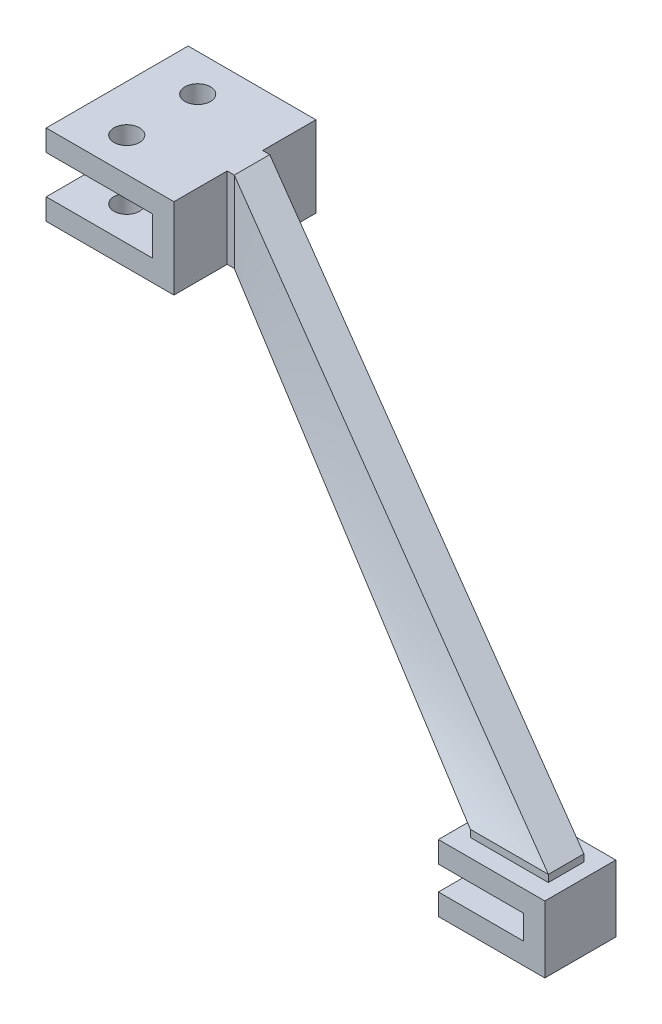
ISO-10303-21;
HEADER;
FILE_DESCRIPTION(('STEP AP214'),'2;1');
FILE_NAME('part.step','',(''),(''),'','','');
FILE_SCHEMA(('AUTOMOTIVE_DESIGN { 1 0 10303 214 1 1 1 1 }'));
ENDSEC;
DATA;
#1=APPLICATION_CONTEXT('core data for automotive mechanical design processes');
#2=APPLICATION_PROTOCOL_DEFINITION('international standard','automotive_design',2000,#1);
#3=PRODUCT_CONTEXT('',#1,'mechanical');
#4=PRODUCT('Part','Part','',(#3));
#5=PRODUCT_RELATED_PRODUCT_CATEGORY('part','',(#4));
#6=PRODUCT_DEFINITION_FORMATION('','',#4);
#7=PRODUCT_DEFINITION_CONTEXT('part definition',#1,'design');
#8=PRODUCT_DEFINITION('design','',#6,#7);
#9=PRODUCT_DEFINITION_SHAPE('','',#8);
#10=(LENGTH_UNIT() NAMED_UNIT(*) SI_UNIT(.MILLI.,.METRE.));
#11=(NAMED_UNIT(*) PLANE_ANGLE_UNIT() SI_UNIT($,.RADIAN.));
#12=(NAMED_UNIT(*) SI_UNIT($,.STERADIAN.) SOLID_ANGLE_UNIT());
#13=UNCERTAINTY_MEASURE_WITH_UNIT(LENGTH_MEASURE(1.E-05),#10,'distance_accuracy_value','');
#14=(GEOMETRIC_REPRESENTATION_CONTEXT(3) GLOBAL_UNCERTAINTY_ASSIGNED_CONTEXT((#13)) GLOBAL_UNIT_ASSIGNED_CONTEXT((#10,
#11,#12)) REPRESENTATION_CONTEXT('',''));
#15=CARTESIAN_POINT('',(0.,0.,0.));
#16=DIRECTION('',(0.,0.,1.));
#17=DIRECTION('',(1.,0.,0.));
#18=AXIS2_PLACEMENT_3D('',#15,#16,#17);
#19=CARTESIAN_POINT('',(221.450000104179,82.6999999999999,83.8053363288418));
#20=DIRECTION('',(1.,0.,-3.19998000319899E-09));
#21=DIRECTION('',(3.19998000319899E-09,0.,1.));
#22=AXIS2_PLACEMENT_3D('',#19,#20,#21);
#23=PLANE('',#22);
#24=DIRECTION('',(0.,-1.,0.));
#25=VECTOR('',#24,1.);
#26=CARTESIAN_POINT('',(221.44999999536,82.6999999999999,49.7989992433643));
#27=LINE('',#26,#25);
#28=CARTESIAN_POINT('',(221.44999999536,82.6999999999999,49.7989992433643));
#29=VERTEX_POINT('',#28);
#30=CARTESIAN_POINT('',(221.44999999536,71.2999999999999,49.7989992433643));
#31=VERTEX_POINT('',#30);
#32=EDGE_CURVE('E329',#29,#31,#27,.T.);
#33=ORIENTED_EDGE('',*,*,#32,.T.);
#34=DIRECTION('',(-3.19998000319899E-09,0.,-1.));
#35=VECTOR('',#34,1.);
#36=CARTESIAN_POINT('',(221.450000104179,71.2999999999999,83.8053363288418));
#37=LINE('',#36,#35);
#38=CARTESIAN_POINT('',(221.44999997136,71.2999999999999,42.2989992433645));
#39=VERTEX_POINT('',#38);
#40=EDGE_CURVE('E459',#31,#39,#37,.T.);
#41=ORIENTED_EDGE('',*,*,#40,.T.);
#42=DIRECTION('',(0.,1.,0.));
#43=VECTOR('',#42,1.);
#44=CARTESIAN_POINT('',(221.44999997136,82.6999999999999,42.2989992433645));
#45=LINE('',#44,#43);
#46=CARTESIAN_POINT('',(221.44999997136,82.6999999999999,42.2989992433645));
#47=VERTEX_POINT('',#46);
#48=EDGE_CURVE('E413',#39,#47,#45,.T.);
#49=ORIENTED_EDGE('',*,*,#48,.T.);
#50=DIRECTION('',(-3.19998000319899E-09,0.,-1.));
#51=VECTOR('',#50,1.);
#52=CARTESIAN_POINT('',(221.450000104179,82.6999999999999,83.8053363288418));
#53=LINE('',#52,#51);
#54=EDGE_CURVE('E456',#29,#47,#53,.T.);
#55=ORIENTED_EDGE('',*,*,#54,.F.);
#56=EDGE_LOOP('',(#33,#41,#49,#55));
#57=FACE_BOUND('',#56,.T.);
#58=ADVANCED_FACE('F100',(#57),#23,.T.);
#59=CARTESIAN_POINT('',(203.450000104179,71.2999999999999,83.8053363864415));
#60=DIRECTION('',(-1.,0.,3.19998000319899E-09));
#61=DIRECTION('',(-3.19998000319899E-09,0.,-1.));
#62=AXIS2_PLACEMENT_3D('',#59,#60,#61);
#63=PLANE('',#62);
#64=DIRECTION('',(0.,1.,0.));
#65=VECTOR('',#64,1.);
#66=CARTESIAN_POINT('',(203.450000035359,71.2999999999999,62.2989993009638));
#67=LINE('',#66,#65);
#68=CARTESIAN_POINT('',(203.44999997136,71.2999999999999,62.2989993009638));
#69=VERTEX_POINT('',#68);
#70=CARTESIAN_POINT('',(203.44999997136,74.2999999999999,62.2989993009638));
#71=VERTEX_POINT('',#70);
#72=EDGE_CURVE('E109',#69,#71,#67,.T.);
#73=ORIENTED_EDGE('',*,*,#72,.T.);
#74=DIRECTION('',(-3.19998000319899E-09,0.,-1.));
#75=VECTOR('',#74,1.);
#76=CARTESIAN_POINT('',(203.450000104179,74.2999999999999,83.8053363864415));
#77=LINE('',#76,#75);
#78=CARTESIAN_POINT('',(203.44999997136,74.2999999999999,42.2989993009641));
#79=VERTEX_POINT('',#78);
#80=EDGE_CURVE('E384',#71,#79,#77,.T.);
#81=ORIENTED_EDGE('',*,*,#80,.T.);
#82=DIRECTION('',(0.,-1.,0.));
#83=VECTOR('',#82,1.);
#84=CARTESIAN_POINT('',(203.44999997136,71.2999999999999,42.2989993009641));
#85=LINE('',#84,#83);
#86=CARTESIAN_POINT('',(203.44999997136,71.2999999999999,42.2989993009641));
#87=VERTEX_POINT('',#86);
#88=EDGE_CURVE('E378',#79,#87,#85,.T.);
#89=ORIENTED_EDGE('',*,*,#88,.T.);
#90=DIRECTION('',(-3.19998000319899E-09,0.,-1.));
#91=VECTOR('',#90,1.);
#92=CARTESIAN_POINT('',(203.450000104179,71.2999999999999,83.8053363864415));
#93=LINE('',#92,#91);
#94=EDGE_CURVE('E432',#69,#87,#93,.T.);
#95=ORIENTED_EDGE('',*,*,#94,.F.);
#96=EDGE_LOOP('',(#73,#81,#89,#95));
#97=FACE_BOUND('',#96,.T.);
#98=ADVANCED_FACE('F102',(#97),#63,.T.);
#99=CARTESIAN_POINT('',(203.450000104179,74.2999999999999,83.8053363864415));
#100=DIRECTION('',(0.,1.,0.));
#101=DIRECTION('',(0.,0.,-1.));
#102=AXIS2_PLACEMENT_3D('',#99,#100,#101);
#103=PLANE('',#102);
#104=CARTESIAN_POINT('',(209.999999988,74.2999999999999,47.4989992800042));
#105=DIRECTION('',(0.,-1.,0.));
#106=DIRECTION('',(0.,0.,-1.));
#107=AXIS2_PLACEMENT_3D('',#104,#105,#106);
#108=CIRCLE('',#107,1.8);
#109=CARTESIAN_POINT('',(209.999999988,74.2999999999999,45.6989992800042));
#110=VERTEX_POINT('',#109);
#111=EDGE_CURVE('E354',#110,#110,#108,.T.);
#112=ORIENTED_EDGE('',*,*,#111,.T.);
#113=EDGE_LOOP('',(#112));
#114=FACE_BOUND('',#113,.T.);
#115=CARTESIAN_POINT('',(210.000000019999,74.2999999999999,57.4989992800042));
#116=DIRECTION('',(0.,-1.,0.));
#117=DIRECTION('',(0.,0.,-1.));
#118=AXIS2_PLACEMENT_3D('',#115,#116,#117);
#119=CIRCLE('',#118,1.8);
#120=CARTESIAN_POINT('',(210.000000019999,74.2999999999999,55.6989992800042));
#121=VERTEX_POINT('',#120);
#122=EDGE_CURVE('E370',#121,#121,#119,.T.);
#123=ORIENTED_EDGE('',*,*,#122,.T.);
#124=EDGE_LOOP('',(#123));
#125=FACE_BOUND('',#124,.T.);
#126=DIRECTION('',(1.,0.,-3.19998172404468E-09));
#127=VECTOR('',#126,1.);
#128=CARTESIAN_POINT('',(203.450000035359,74.2999999999999,62.2989993009638));
#129=LINE('',#128,#127);
#130=CARTESIAN_POINT('',(218.450000035359,74.2999999999999,62.2989992529641));
#131=VERTEX_POINT('',#130);
#132=EDGE_CURVE('E400',#71,#131,#129,.T.);
#133=ORIENTED_EDGE('',*,*,#132,.T.);
#134=DIRECTION('',(-3.19998000319899E-09,0.,-1.));
#135=VECTOR('',#134,1.);
#136=CARTESIAN_POINT('',(218.450000104179,74.2999999999999,83.8053363384417));
#137=LINE('',#136,#135);
#138=CARTESIAN_POINT('',(218.44999997136,74.2999999999999,42.2989992529644));
#139=VERTEX_POINT('',#138);
#140=EDGE_CURVE('E436',#131,#139,#137,.T.);
#141=ORIENTED_EDGE('',*,*,#140,.T.);
#142=DIRECTION('',(-1.,0.,3.19998009571757E-09));
#143=VECTOR('',#142,1.);
#144=CARTESIAN_POINT('',(203.44999997136,74.2999999999999,42.2989993009641));
#145=LINE('',#144,#143);
#146=EDGE_CURVE('E429',#139,#79,#145,.T.);
#147=ORIENTED_EDGE('',*,*,#146,.T.);
#148=ORIENTED_EDGE('',*,*,#80,.F.);
#149=EDGE_LOOP('',(#133,#141,#147,#148));
#150=FACE_BOUND('',#149,.T.);
#151=ADVANCED_FACE('F648',(#114,#125,#150),#103,.T.);
#152=CARTESIAN_POINT('',(218.450000104179,74.2999999999999,83.8053363384417));
#153=DIRECTION('',(-1.,0.,3.19998000319899E-09));
#154=DIRECTION('',(-3.19998000319899E-09,0.,-1.));
#155=AXIS2_PLACEMENT_3D('',#152,#153,#154);
#156=PLANE('',#155);
#157=DIRECTION('',(0.,1.,0.));
#158=VECTOR('',#157,1.);
#159=CARTESIAN_POINT('',(218.450000035359,74.2999999999999,62.2989992529641));
#160=LINE('',#159,#158);
#161=CARTESIAN_POINT('',(218.450000104179,79.6999999999999,62.2989992529641));
#162=VERTEX_POINT('',#161);
#163=EDGE_CURVE('E396',#131,#162,#160,.T.);
#164=ORIENTED_EDGE('',*,*,#163,.T.);
#165=DIRECTION('',(-3.19998000319899E-09,0.,-1.));
#166=VECTOR('',#165,1.);
#167=CARTESIAN_POINT('',(218.450000104179,79.6999999999999,83.8053363384417));
#168=LINE('',#167,#166);
#169=CARTESIAN_POINT('',(218.44999997136,79.6999999999999,42.2989992529644));
#170=VERTEX_POINT('',#169);
#171=EDGE_CURVE('E440',#162,#170,#168,.T.);
#172=ORIENTED_EDGE('',*,*,#171,.T.);
#173=DIRECTION('',(0.,-1.,0.));
#174=VECTOR('',#173,1.);
#175=CARTESIAN_POINT('',(218.44999997136,74.2999999999999,42.2989992529644));
#176=LINE('',#175,#174);
#177=EDGE_CURVE('E426',#170,#139,#176,.T.);
#178=ORIENTED_EDGE('',*,*,#177,.T.);
#179=ORIENTED_EDGE('',*,*,#140,.F.);
#180=EDGE_LOOP('',(#164,#172,#178,#179));
#181=FACE_BOUND('',#180,.T.);
#182=ADVANCED_FACE('F674',(#181),#156,.T.);
#183=CARTESIAN_POINT('',(218.450000104179,79.6999999999999,83.8053363384417));
#184=DIRECTION('',(0.,-1.,0.));
#185=DIRECTION('',(0.,0.,1.));
#186=AXIS2_PLACEMENT_3D('',#183,#184,#185);
#187=PLANE('',#186);
#188=CARTESIAN_POINT('',(209.999999988,79.6999999999999,47.4989992800042));
#189=DIRECTION('',(0.,1.,0.));
#190=DIRECTION('',(0.,0.,1.));
#191=AXIS2_PLACEMENT_3D('',#188,#189,#190);
#192=CIRCLE('',#191,1.8);
#193=CARTESIAN_POINT('',(209.999999988,79.6999999999999,49.2989992800042));
#194=VERTEX_POINT('',#193);
#195=EDGE_CURVE('E358',#194,#194,#192,.T.);
#196=ORIENTED_EDGE('',*,*,#195,.T.);
#197=EDGE_LOOP('',(#196));
#198=FACE_BOUND('',#197,.T.);
#199=CARTESIAN_POINT('',(210.000000019999,79.6999999999999,57.4989992800042));
#200=DIRECTION('',(0.,1.,0.));
#201=DIRECTION('',(0.,0.,1.));
#202=AXIS2_PLACEMENT_3D('',#199,#200,#201);
#203=CIRCLE('',#202,1.8);
#204=CARTESIAN_POINT('',(210.000000019999,79.6999999999999,59.2989992800042));
#205=VERTEX_POINT('',#204);
#206=EDGE_CURVE('E374',#205,#205,#203,.T.);
#207=ORIENTED_EDGE('',*,*,#206,.T.);
#208=EDGE_LOOP('',(#207));
#209=FACE_BOUND('',#208,.T.);
#210=DIRECTION('',(-1.,0.,3.19998172404468E-09));
#211=VECTOR('',#210,1.);
#212=CARTESIAN_POINT('',(218.450000035359,79.6999999999999,62.2989992529641));
#213=LINE('',#212,#211);
#214=CARTESIAN_POINT('',(203.450000035359,79.6999999999999,62.2989993009638));
#215=VERTEX_POINT('',#214);
#216=EDGE_CURVE('E392',#162,#215,#213,.T.);
#217=ORIENTED_EDGE('',*,*,#216,.T.);
#218=DIRECTION('',(-3.19998000319899E-09,0.,-1.));
#219=VECTOR('',#218,1.);
#220=CARTESIAN_POINT('',(203.450000104179,79.6999999999999,83.8053363864415));
#221=LINE('',#220,#219);
#222=CARTESIAN_POINT('',(203.44999997136,79.6999999999999,42.2989993009641));
#223=VERTEX_POINT('',#222);
#224=EDGE_CURVE('E444',#215,#223,#221,.T.);
#225=ORIENTED_EDGE('',*,*,#224,.T.);
#226=DIRECTION('',(1.,0.,-3.19998009571757E-09));
#227=VECTOR('',#226,1.);
#228=CARTESIAN_POINT('',(218.44999997136,79.6999999999999,42.2989992529644));
#229=LINE('',#228,#227);
#230=EDGE_CURVE('E423',#223,#170,#229,.T.);
#231=ORIENTED_EDGE('',*,*,#230,.T.);
#232=ORIENTED_EDGE('',*,*,#171,.F.);
#233=EDGE_LOOP('',(#217,#225,#231,#232));
#234=FACE_BOUND('',#233,.T.);
#235=ADVANCED_FACE('F677',(#198,#209,#234),#187,.T.);
#236=CARTESIAN_POINT('',(203.450000104179,79.6999999999999,83.8053363864415));
#237=DIRECTION('',(-1.,0.,3.19998000319899E-09));
#238=DIRECTION('',(-3.19998000319899E-09,0.,-1.));
#239=AXIS2_PLACEMENT_3D('',#236,#237,#238);
#240=PLANE('',#239);
#241=DIRECTION('',(0.,1.,0.));
#242=VECTOR('',#241,1.);
#243=CARTESIAN_POINT('',(203.450000035359,79.6999999999999,62.2989993009638));
#244=LINE('',#243,#242);
#245=CARTESIAN_POINT('',(203.44999997136,82.6999999999999,62.2989993009638));
#246=VERTEX_POINT('',#245);
#247=EDGE_CURVE('E388',#215,#246,#244,.T.);
#248=ORIENTED_EDGE('',*,*,#247,.T.);
#249=DIRECTION('',(-3.19998000319899E-09,0.,-1.));
#250=VECTOR('',#249,1.);
#251=CARTESIAN_POINT('',(203.450000104179,82.6999999999999,83.8053363864415));
#252=LINE('',#251,#250);
#253=CARTESIAN_POINT('',(203.44999997136,82.6999999999999,42.2989993009641));
#254=VERTEX_POINT('',#253);
#255=EDGE_CURVE('E448',#246,#254,#252,.T.);
#256=ORIENTED_EDGE('',*,*,#255,.T.);
#257=DIRECTION('',(0.,-1.,0.));
#258=VECTOR('',#257,1.);
#259=CARTESIAN_POINT('',(203.44999997136,79.6999999999999,42.2989993009641));
#260=LINE('',#259,#258);
#261=EDGE_CURVE('E420',#254,#223,#260,.T.);
#262=ORIENTED_EDGE('',*,*,#261,.T.);
#263=ORIENTED_EDGE('',*,*,#224,.F.);
#264=EDGE_LOOP('',(#248,#256,#262,#263));
#265=FACE_BOUND('',#264,.T.);
#266=ADVANCED_FACE('F658',(#265),#240,.T.);
#267=CARTESIAN_POINT('',(203.450000104179,82.6999999999999,83.8053363864415));
#268=DIRECTION('',(0.,1.,0.));
#269=DIRECTION('',(0.,0.,-1.));
#270=AXIS2_PLACEMENT_3D('',#267,#268,#269);
#271=PLANE('',#270);
#272=CARTESIAN_POINT('',(209.999999988,82.6999999999999,47.4989992800042));
#273=DIRECTION('',(0.,-1.,0.));
#274=DIRECTION('',(0.,0.,-1.));
#275=AXIS2_PLACEMENT_3D('',#272,#273,#274);
#276=CIRCLE('',#275,1.8);
#277=CARTESIAN_POINT('',(209.999999988,82.6999999999999,45.6989992800042));
#278=VERTEX_POINT('',#277);
#279=EDGE_CURVE('E346',#278,#278,#276,.T.);
#280=ORIENTED_EDGE('',*,*,#279,.T.);
#281=EDGE_LOOP('',(#280));
#282=FACE_BOUND('',#281,.T.);
#283=CARTESIAN_POINT('',(210.000000019999,82.6999999999999,57.4989992800042));
#284=DIRECTION('',(0.,-1.,0.));
#285=DIRECTION('',(0.,0.,-1.));
#286=AXIS2_PLACEMENT_3D('',#283,#284,#285);
#287=CIRCLE('',#286,1.8);
#288=CARTESIAN_POINT('',(210.000000019999,82.6999999999999,55.6989992800042));
#289=VERTEX_POINT('',#288);
#290=EDGE_CURVE('E362',#289,#289,#287,.T.);
#291=ORIENTED_EDGE('',*,*,#290,.T.);
#292=EDGE_LOOP('',(#291));
#293=FACE_BOUND('',#292,.T.);
#294=DIRECTION('',(1.,0.,-3.19998172404468E-09));
#295=VECTOR('',#294,1.);
#296=CARTESIAN_POINT('',(203.450000035359,82.6999999999999,62.2989993009638));
#297=LINE('',#296,#295);
#298=CARTESIAN_POINT('',(221.450000035359,82.6999999999999,62.2989992433642));
#299=VERTEX_POINT('',#298);
#300=EDGE_CURVE('E383',#246,#299,#297,.T.);
#301=ORIENTED_EDGE('',*,*,#300,.T.);
#302=CARTESIAN_POINT('',(221.450000011359,82.6999999999999,54.7989992433643));
#303=VERTEX_POINT('',#302);
#304=EDGE_CURVE('E452',#299,#303,#53,.T.);
#305=ORIENTED_EDGE('',*,*,#304,.T.);
#306=DIRECTION('',(-1.,0.,3.19998000319899E-09));
#307=VECTOR('',#306,1.);
#308=CARTESIAN_POINT('',(222.450000011359,82.6999999999999,54.7989992401643));
#309=LINE('',#308,#307);
#310=CARTESIAN_POINT('',(222.450000011359,82.6999999999999,54.7989992401643));
#311=VERTEX_POINT('',#310);
#312=EDGE_CURVE('E338',#311,#303,#309,.T.);
#313=ORIENTED_EDGE('',*,*,#312,.F.);
#314=DIRECTION('',(-3.19997917053172E-09,0.,-1.));
#315=VECTOR('',#314,1.);
#316=CARTESIAN_POINT('',(222.44999999536,82.6999999999999,49.7989992401643));
#317=LINE('',#316,#315);
#318=CARTESIAN_POINT('',(222.44999999536,82.6999999999999,49.7989992401643));
#319=VERTEX_POINT('',#318);
#320=EDGE_CURVE('E324',#311,#319,#317,.T.);
#321=ORIENTED_EDGE('',*,*,#320,.T.);
#322=DIRECTION('',(-1.,0.,3.19998000319899E-09));
#323=VECTOR('',#322,1.);
#324=CARTESIAN_POINT('',(222.44999999536,82.6999999999999,49.7989992401643));
#325=LINE('',#324,#323);
#326=EDGE_CURVE('E328',#319,#29,#325,.T.);
#327=ORIENTED_EDGE('',*,*,#326,.T.);
#328=ORIENTED_EDGE('',*,*,#54,.T.);
#329=DIRECTION('',(-1.,0.,3.19998001861875E-09));
#330=VECTOR('',#329,1.);
#331=CARTESIAN_POINT('',(203.44999997136,82.6999999999999,42.2989993009641));
#332=LINE('',#331,#330);
#333=EDGE_CURVE('E417',#47,#254,#332,.T.);
#334=ORIENTED_EDGE('',*,*,#333,.T.);
#335=ORIENTED_EDGE('',*,*,#255,.F.);
#336=EDGE_LOOP('',(#301,#305,#313,#321,#327,#328,#334,#335));
#337=FACE_BOUND('',#336,.T.);
#338=ADVANCED_FACE('F477',(#282,#293,#337),#271,.T.);
#339=DIRECTION('',(0.,1.,0.));
#340=VECTOR('',#339,1.);
#341=CARTESIAN_POINT('',(221.450000011359,82.6999999999999,54.7989992433643));
#342=LINE('',#341,#340);
#343=CARTESIAN_POINT('',(221.450000011359,71.2999999999999,54.7989992433643));
#344=VERTEX_POINT('',#343);
#345=EDGE_CURVE('E319',#344,#303,#342,.T.);
#346=ORIENTED_EDGE('',*,*,#345,.T.);
#347=ORIENTED_EDGE('',*,*,#304,.F.);
#348=DIRECTION('',(0.,-1.,0.));
#349=VECTOR('',#348,1.);
#350=CARTESIAN_POINT('',(221.450000035359,82.6999999999999,62.2989992433642));
#351=LINE('',#350,#349);
#352=CARTESIAN_POINT('',(221.450000035359,71.2999999999999,62.298999272164));
#353=VERTEX_POINT('',#352);
#354=EDGE_CURVE('E379',#299,#353,#351,.T.);
#355=ORIENTED_EDGE('',*,*,#354,.T.);
#356=EDGE_CURVE('E457',#353,#344,#37,.T.);
#357=ORIENTED_EDGE('',*,*,#356,.T.);
#358=EDGE_LOOP('',(#346,#347,#355,#357));
#359=FACE_BOUND('',#358,.T.);
#360=ADVANCED_FACE('F644',(#359),#23,.T.);
#361=CARTESIAN_POINT('',(221.450000104179,71.2999999999999,83.8053363288418));
#362=DIRECTION('',(0.,-1.,0.));
#363=DIRECTION('',(0.,0.,1.));
#364=AXIS2_PLACEMENT_3D('',#361,#362,#363);
#365=PLANE('',#364);
#366=CARTESIAN_POINT('',(209.999999988,71.2999999999999,47.4989992800042));
#367=DIRECTION('',(0.,-1.,0.));
#368=DIRECTION('',(0.,0.,-1.));
#369=AXIS2_PLACEMENT_3D('',#366,#367,#368);
#370=CIRCLE('',#369,1.8);
#371=CARTESIAN_POINT('',(209.999999988,71.2999999999999,45.6989992800042));
#372=VERTEX_POINT('',#371);
#373=EDGE_CURVE('E350',#372,#372,#370,.T.);
#374=ORIENTED_EDGE('',*,*,#373,.F.);
#375=EDGE_LOOP('',(#374));
#376=FACE_BOUND('',#375,.T.);
#377=CARTESIAN_POINT('',(210.000000019999,71.2999999999999,57.4989992800042));
#378=DIRECTION('',(0.,-1.,0.));
#379=DIRECTION('',(0.,0.,-1.));
#380=AXIS2_PLACEMENT_3D('',#377,#378,#379);
#381=CIRCLE('',#380,1.8);
#382=CARTESIAN_POINT('',(210.000000019999,71.2999999999999,55.6989992800042));
#383=VERTEX_POINT('',#382);
#384=EDGE_CURVE('E366',#383,#383,#381,.T.);
#385=ORIENTED_EDGE('',*,*,#384,.F.);
#386=EDGE_LOOP('',(#385));
#387=FACE_BOUND('',#386,.T.);
#388=DIRECTION('',(-1.,0.,3.19998172404468E-09));
#389=VECTOR('',#388,1.);
#390=CARTESIAN_POINT('',(221.450000035359,71.2999999999999,62.2989992433642));
#391=LINE('',#390,#389);
#392=EDGE_CURVE('E13',#353,#69,#391,.T.);
#393=ORIENTED_EDGE('',*,*,#392,.T.);
#394=ORIENTED_EDGE('',*,*,#94,.T.);
#395=DIRECTION('',(1.,0.,-3.19998001861875E-09));
#396=VECTOR('',#395,1.);
#397=CARTESIAN_POINT('',(221.44999997136,71.2999999999999,42.2989992433645));
#398=LINE('',#397,#396);
#399=EDGE_CURVE('E410',#87,#39,#398,.T.);
#400=ORIENTED_EDGE('',*,*,#399,.T.);
#401=ORIENTED_EDGE('',*,*,#40,.F.);
#402=DIRECTION('',(-1.,0.,3.19998000319899E-09));
#403=VECTOR('',#402,1.);
#404=CARTESIAN_POINT('',(222.44999999536,71.2999999999999,49.7989992401643));
#405=LINE('',#404,#403);
#406=CARTESIAN_POINT('',(222.44999999536,71.2999999999999,49.7989992401643));
#407=VERTEX_POINT('',#406);
#408=EDGE_CURVE('E116',#407,#31,#405,.T.);
#409=ORIENTED_EDGE('',*,*,#408,.F.);
#410=DIRECTION('',(3.19997917053172E-09,0.,1.));
#411=VECTOR('',#410,1.);
#412=CARTESIAN_POINT('',(222.44999999536,71.2999999999999,49.7989992401643));
#413=LINE('',#412,#411);
#414=CARTESIAN_POINT('',(222.450000011359,71.2999999999999,54.7989992401643));
#415=VERTEX_POINT('',#414);
#416=EDGE_CURVE('E318',#407,#415,#413,.T.);
#417=ORIENTED_EDGE('',*,*,#416,.T.);
#418=DIRECTION('',(-1.,0.,3.19998000319899E-09));
#419=VECTOR('',#418,1.);
#420=CARTESIAN_POINT('',(222.450000011359,71.2999999999999,54.7989992401643));
#421=LINE('',#420,#419);
#422=EDGE_CURVE('E124',#415,#344,#421,.T.);
#423=ORIENTED_EDGE('',*,*,#422,.T.);
#424=ORIENTED_EDGE('',*,*,#356,.F.);
#425=EDGE_LOOP('',(#393,#394,#400,#401,#409,#417,#423,#424));
#426=FACE_BOUND('',#425,.T.);
#427=ADVANCED_FACE('F468',(#376,#387,#426),#365,.T.);
#428=CARTESIAN_POINT('',(1.35355957286032E-07,0.,42.298999952));
#429=DIRECTION('',(3.19998009571757E-09,0.,1.));
#430=DIRECTION('',(-1.,0.,3.19998009571757E-09));
#431=AXIS2_PLACEMENT_3D('',#428,#429,#430);
#432=PLANE('',#431);
#433=ORIENTED_EDGE('',*,*,#88,.F.);
#434=ORIENTED_EDGE('',*,*,#146,.F.);
#435=ORIENTED_EDGE('',*,*,#177,.F.);
#436=ORIENTED_EDGE('',*,*,#230,.F.);
#437=ORIENTED_EDGE('',*,*,#261,.F.);
#438=ORIENTED_EDGE('',*,*,#333,.F.);
#439=ORIENTED_EDGE('',*,*,#48,.F.);
#440=ORIENTED_EDGE('',*,*,#399,.F.);
#441=EDGE_LOOP('',(#433,#434,#435,#436,#437,#438,#439,#440));
#442=FACE_BOUND('',#441,.T.);
#443=ADVANCED_FACE('F471',(#442),#432,.F.);
#444=CARTESIAN_POINT('',(195.000000035359,35.4999999999999,62.2989993280037));
#445=DIRECTION('',(-3.19998172404468E-09,0.,-1.));
#446=DIRECTION('',(1.,0.,-3.19998172404468E-09));
#447=AXIS2_PLACEMENT_3D('',#444,#445,#446);
#448=PLANE('',#447);
#449=ORIENTED_EDGE('',*,*,#72,.F.);
#450=ORIENTED_EDGE('',*,*,#392,.F.);
#451=ORIENTED_EDGE('',*,*,#354,.F.);
#452=ORIENTED_EDGE('',*,*,#300,.F.);
#453=ORIENTED_EDGE('',*,*,#247,.F.);
#454=ORIENTED_EDGE('',*,*,#216,.F.);
#455=ORIENTED_EDGE('',*,*,#163,.F.);
#456=ORIENTED_EDGE('',*,*,#132,.F.);
#457=EDGE_LOOP('',(#449,#450,#451,#452,#453,#454,#455,#456));
#458=FACE_BOUND('',#457,.T.);
#459=ADVANCED_FACE('F666',(#458),#448,.F.);
#460=CARTESIAN_POINT('',(210.000000019999,82.6999999999999,57.4989992800042));
#461=DIRECTION('',(0.,1.,0.));
#462=DIRECTION('',(0.,0.,-1.));
#463=AXIS2_PLACEMENT_3D('',#460,#461,#462);
#464=CYLINDRICAL_SURFACE('',#463,1.8);
#465=ORIENTED_EDGE('',*,*,#122,.F.);
#466=EDGE_LOOP('',(#465));
#467=FACE_BOUND('',#466,.T.);
#468=ORIENTED_EDGE('',*,*,#384,.T.);
#469=EDGE_LOOP('',(#468));
#470=FACE_BOUND('',#469,.T.);
#471=ADVANCED_FACE('F696',(#467,#470),#464,.F.);
#472=ORIENTED_EDGE('',*,*,#206,.F.);
#473=EDGE_LOOP('',(#472));
#474=FACE_BOUND('',#473,.T.);
#475=ORIENTED_EDGE('',*,*,#290,.F.);
#476=EDGE_LOOP('',(#475));
#477=FACE_BOUND('',#476,.T.);
#478=ADVANCED_FACE('F699',(#474,#477),#464,.F.);
#479=CARTESIAN_POINT('',(209.999999988,82.6999999999999,47.4989992800042));
#480=DIRECTION('',(0.,1.,0.));
#481=DIRECTION('',(0.,0.,-1.));
#482=AXIS2_PLACEMENT_3D('',#479,#480,#481);
#483=CYLINDRICAL_SURFACE('',#482,1.8);
#484=ORIENTED_EDGE('',*,*,#111,.F.);
#485=EDGE_LOOP('',(#484));
#486=FACE_BOUND('',#485,.T.);
#487=ORIENTED_EDGE('',*,*,#373,.T.);
#488=EDGE_LOOP('',(#487));
#489=FACE_BOUND('',#488,.T.);
#490=ADVANCED_FACE('F701',(#486,#489),#483,.F.);
#491=ORIENTED_EDGE('',*,*,#195,.F.);
#492=EDGE_LOOP('',(#491));
#493=FACE_BOUND('',#492,.T.);
#494=ORIENTED_EDGE('',*,*,#279,.F.);
#495=EDGE_LOOP('',(#494));
#496=FACE_BOUND('',#495,.T.);
#497=ADVANCED_FACE('F704',(#493,#496),#483,.F.);
#498=CARTESIAN_POINT('',(222.44999999536,82.6999999999999,49.7989992401643));
#499=DIRECTION('',(3.19998000319899E-09,0.,1.));
#500=DIRECTION('',(-1.,0.,3.19998000319899E-09));
#501=AXIS2_PLACEMENT_3D('',#498,#499,#500);
#502=PLANE('',#501);
#503=ORIENTED_EDGE('',*,*,#32,.F.);
#504=ORIENTED_EDGE('',*,*,#326,.F.);
#505=DIRECTION('',(0.,-1.,0.));
#506=VECTOR('',#505,1.);
#507=CARTESIAN_POINT('',(222.44999999536,82.6999999999999,49.7989992401643));
#508=LINE('',#507,#506);
#509=EDGE_CURVE('E315',#319,#407,#508,.T.);
#510=ORIENTED_EDGE('',*,*,#509,.T.);
#511=ORIENTED_EDGE('',*,*,#408,.T.);
#512=EDGE_LOOP('',(#503,#504,#510,#511));
#513=FACE_BOUND('',#512,.T.);
#514=ADVANCED_FACE('F480',(#513),#502,.F.);
#515=CARTESIAN_POINT('',(222.450000011359,82.6999999999999,54.7989992401643));
#516=DIRECTION('',(-3.19998000319899E-09,0.,-1.));
#517=DIRECTION('',(1.,0.,-3.19998000319899E-09));
#518=AXIS2_PLACEMENT_3D('',#515,#516,#517);
#519=PLANE('',#518);
#520=ORIENTED_EDGE('',*,*,#345,.F.);
#521=ORIENTED_EDGE('',*,*,#422,.F.);
#522=DIRECTION('',(0.,1.,0.));
#523=VECTOR('',#522,1.);
#524=CARTESIAN_POINT('',(222.450000011359,82.6999999999999,54.7989992401643));
#525=LINE('',#524,#523);
#526=EDGE_CURVE('E302',#415,#311,#525,.T.);
#527=ORIENTED_EDGE('',*,*,#526,.T.);
#528=ORIENTED_EDGE('',*,*,#312,.T.);
#529=EDGE_LOOP('',(#520,#521,#527,#528));
#530=FACE_BOUND('',#529,.T.);
#531=ADVANCED_FACE('F663',(#530),#519,.F.);
#532=CARTESIAN_POINT('',(222.450000011359,71.2999999999999,54.7989992401643));
#533=CARTESIAN_POINT('',(275.91012158268,39.6999999999998,74.9989990274929));
#534=CARTESIAN_POINT('',(222.450000011359,82.6999999999999,54.7989992401643));
#535=CARTESIAN_POINT('',(286.91012155068,39.6999999999998,74.9989990274929));
#536=B_SPLINE_SURFACE_WITH_KNOTS('',1,1,((#532,#533),(#534,#535)),.UNSPECIFIED.,.F.,.F.,.F.,(2,
2),(2,2),(0.,1.),(0.,1.),.UNSPECIFIED.);
#537=DIRECTION('',(0.81863738795725,-0.483892305125749,0.309323558880696));
#538=VECTOR('',#537,1.);
#539=CARTESIAN_POINT('',(249.18006079702,55.4999999999999,64.8989991338286));
#540=LINE('',#539,#538);
#541=CARTESIAN_POINT('',(275.91012158268,39.6999999999998,74.9989990274929));
#542=VERTEX_POINT('',#541);
#543=EDGE_CURVE('E284',#415,#542,#540,.T.);
#544=DIRECTION('',(1.,0.,0.));
#545=VECTOR('',#544,1.);
#546=CARTESIAN_POINT('',(281.41012156668,39.6999999999998,74.9989990274929));
#547=LINE('',#546,#545);
#548=CARTESIAN_POINT('',(286.91012155068,39.6999999999998,74.9989990274929));
#549=VERTEX_POINT('',#548);
#550=EDGE_CURVE('E293',#542,#549,#547,.T.);
#551=DIRECTION('',(0.804987944038599,-0.536990634939229,0.252260714222554));
#552=VECTOR('',#551,1.);
#553=CARTESIAN_POINT('',(254.68006078102,61.1999999999999,64.8989991338286));
#554=LINE('',#553,#552);
#555=EDGE_CURVE('E333',#311,#549,#554,.T.);
#556=ORIENTED_EDGE('',*,*,#526,.F.);
#557=ORIENTED_EDGE('',*,*,#543,.T.);
#558=ORIENTED_EDGE('',*,*,#550,.T.);
#559=ORIENTED_EDGE('',*,*,#555,.F.);
#560=EDGE_LOOP('',(#556,#557,#558,#559));
#561=FACE_BOUND('',#560,.T.);
#562=ADVANCED_FACE('F300',(#561),#536,.F.);
#563=CARTESIAN_POINT('',(222.450000011359,82.6999999999999,54.7989992401643));
#564=DIRECTION('',(0.554937705972671,0.831891905532077,-1.7757891000552E-09));
#565=DIRECTION('',(-3.19997917053172E-09,0.,-1.));
#566=AXIS2_PLACEMENT_3D('',#563,#564,#565);
#567=PLANE('',#566);
#568=ORIENTED_EDGE('',*,*,#320,.F.);
#569=ORIENTED_EDGE('',*,*,#555,.T.);
#570=DIRECTION('',(0.,0.,-1.));
#571=VECTOR('',#570,1.);
#572=CARTESIAN_POINT('',(286.91012155068,39.6999999999998,72.4989990274929));
#573=LINE('',#572,#571);
#574=CARTESIAN_POINT('',(286.91012155068,39.6999999999998,69.9989990274929));
#575=VERTEX_POINT('',#574);
#576=EDGE_CURVE('E298',#549,#575,#573,.T.);
#577=ORIENTED_EDGE('',*,*,#576,.T.);
#578=DIRECTION('',(0.804987944108931,-0.536990634852857,0.252260714181979));
#579=VECTOR('',#578,1.);
#580=CARTESIAN_POINT('',(254.68006077302,61.1999999999999,59.8989991338286));
#581=LINE('',#580,#579);
#582=EDGE_CURVE('E306',#319,#575,#581,.T.);
#583=ORIENTED_EDGE('',*,*,#582,.F.);
#584=EDGE_LOOP('',(#568,#569,#577,#583));
#585=FACE_BOUND('',#584,.T.);
#586=ADVANCED_FACE('F486',(#585),#567,.T.);
#587=CARTESIAN_POINT('',(222.44999999536,82.6999999999999,49.7989992401643));
#588=CARTESIAN_POINT('',(286.91012155068,39.6999999999998,69.9989990274929));
#589=CARTESIAN_POINT('',(222.44999999536,71.2999999999999,49.7989992401643));
#590=CARTESIAN_POINT('',(275.91012158268,39.6999999999998,69.9989990274929));
#591=B_SPLINE_SURFACE_WITH_KNOTS('',1,1,((#587,#588),(#589,#590)),.UNSPECIFIED.,.F.,.F.,.F.,(2,
2),(2,2),(0.,1.),(0.,1.),.UNSPECIFIED.);
#592=DIRECTION('',(-1.,0.,0.));
#593=VECTOR('',#592,1.);
#594=CARTESIAN_POINT('',(281.41012156668,39.6999999999998,69.9989990274929));
#595=LINE('',#594,#593);
#596=CARTESIAN_POINT('',(275.91012158268,39.6999999999998,69.9989990274929));
#597=VERTEX_POINT('',#596);
#598=EDGE_CURVE('E289',#575,#597,#595,.T.);
#599=DIRECTION('',(0.818637388038062,-0.483892305028694,0.309323558818655));
#600=VECTOR('',#599,1.);
#601=CARTESIAN_POINT('',(249.18006078902,55.4999999999999,59.8989991338286));
#602=LINE('',#601,#600);
#603=EDGE_CURVE('E286',#407,#597,#602,.T.);
#604=ORIENTED_EDGE('',*,*,#509,.F.);
#605=ORIENTED_EDGE('',*,*,#582,.T.);
#606=ORIENTED_EDGE('',*,*,#598,.T.);
#607=ORIENTED_EDGE('',*,*,#603,.F.);
#608=EDGE_LOOP('',(#604,#605,#606,#607));
#609=FACE_BOUND('',#608,.T.);
#610=ADVANCED_FACE('F490',(#609),#591,.F.);
#611=CARTESIAN_POINT('',(222.44999999536,71.2999999999999,49.7989992401643));
#612=DIRECTION('',(-0.50884780315544,-0.860856499786046,1.62830237106823E-09));
#613=DIRECTION('',(3.19997917053172E-09,0.,1.));
#614=AXIS2_PLACEMENT_3D('',#611,#612,#613);
#615=PLANE('',#614);
#616=ORIENTED_EDGE('',*,*,#416,.F.);
#617=ORIENTED_EDGE('',*,*,#603,.T.);
#618=DIRECTION('',(0.,0.,1.));
#619=VECTOR('',#618,1.);
#620=CARTESIAN_POINT('',(275.91012158268,39.6999999999998,72.4989990274929));
#621=LINE('',#620,#619);
#622=EDGE_CURVE('E268',#597,#542,#621,.T.);
#623=ORIENTED_EDGE('',*,*,#622,.T.);
#624=ORIENTED_EDGE('',*,*,#543,.F.);
#625=EDGE_LOOP('',(#616,#617,#623,#624));
#626=FACE_BOUND('',#625,.T.);
#627=ADVANCED_FACE('F282',(#626),#615,.T.);
#628=CARTESIAN_POINT('',(273.91012158268,38.6999999999998,77.4989990754926));
#629=DIRECTION('',(-1.,0.,3.19998200160043E-09));
#630=DIRECTION('',(-3.19998200160043E-09,0.,-1.));
#631=AXIS2_PLACEMENT_3D('',#628,#629,#630);
#632=PLANE('',#631);
#633=DIRECTION('',(0.,-1.,0.));
#634=VECTOR('',#633,1.);
#635=CARTESIAN_POINT('',(273.91012155068,38.6999999999998,67.4989990754926));
#636=LINE('',#635,#634);
#637=CARTESIAN_POINT('',(273.91012155068,38.6999999999998,67.4989990754926));
#638=VERTEX_POINT('',#637);
#639=CARTESIAN_POINT('',(273.91012155068,35.6999999999998,67.4989990754926));
#640=VERTEX_POINT('',#639);
#641=EDGE_CURVE('E510',#638,#640,#636,.T.);
#642=ORIENTED_EDGE('',*,*,#641,.T.);
#643=DIRECTION('',(-3.19998200160043E-09,0.,-1.));
#644=VECTOR('',#643,1.);
#645=CARTESIAN_POINT('',(273.91012158268,35.6999999999998,77.4989990754926));
#646=LINE('',#645,#644);
#647=CARTESIAN_POINT('',(273.91012158268,35.6999999999998,77.4989990754926));
#648=VERTEX_POINT('',#647);
#649=EDGE_CURVE('E537',#648,#640,#646,.T.);
#650=ORIENTED_EDGE('',*,*,#649,.F.);
#651=DIRECTION('',(0.,-1.,0.));
#652=VECTOR('',#651,1.);
#653=CARTESIAN_POINT('',(273.91012158268,38.6999999999998,77.4989990754926));
#654=LINE('',#653,#652);
#655=CARTESIAN_POINT('',(273.91012158268,38.6999999999998,77.4989990754926));
#656=VERTEX_POINT('',#655);
#657=EDGE_CURVE('E511',#656,#648,#654,.T.);
#658=ORIENTED_EDGE('',*,*,#657,.F.);
#659=DIRECTION('',(-3.19998200160043E-09,0.,-1.));
#660=VECTOR('',#659,1.);
#661=CARTESIAN_POINT('',(273.91012158268,38.6999999999998,77.4989990754926));
#662=LINE('',#661,#660);
#663=EDGE_CURVE('E290',#656,#638,#662,.T.);
#664=ORIENTED_EDGE('',*,*,#663,.T.);
#665=EDGE_LOOP('',(#642,#650,#658,#664));
#666=FACE_BOUND('',#665,.T.);
#667=ADVANCED_FACE('F599',(#666),#632,.T.);
#668=CARTESIAN_POINT('',(288.91012158268,38.6999999999998,77.4989990274929));
#669=DIRECTION('',(0.,1.,0.));
#670=DIRECTION('',(-1.,0.,0.));
#671=AXIS2_PLACEMENT_3D('',#668,#669,#670);
#672=PLANE('',#671);
#673=DIRECTION('',(1.,0.,0.));
#674=VECTOR('',#673,1.);
#675=CARTESIAN_POINT('',(286.91012155068,38.6999999999998,69.9989990274929));
#676=LINE('',#675,#674);
#677=CARTESIAN_POINT('',(275.91012158268,38.6999999999998,69.9989990274929));
#678=VERTEX_POINT('',#677);
#679=CARTESIAN_POINT('',(286.91012155068,38.6999999999998,69.9989990274929));
#680=VERTEX_POINT('',#679);
#681=EDGE_CURVE('E498',#678,#680,#676,.T.);
#682=ORIENTED_EDGE('',*,*,#681,.T.);
#683=DIRECTION('',(0.,0.,1.));
#684=VECTOR('',#683,1.);
#685=CARTESIAN_POINT('',(286.91012155068,38.6999999999998,74.9989990274929));
#686=LINE('',#685,#684);
#687=CARTESIAN_POINT('',(286.91012155068,38.6999999999998,74.9989990274929));
#688=VERTEX_POINT('',#687);
#689=EDGE_CURVE('E969',#680,#688,#686,.T.);
#690=ORIENTED_EDGE('',*,*,#689,.T.);
#691=DIRECTION('',(-1.,0.,0.));
#692=VECTOR('',#691,1.);
#693=CARTESIAN_POINT('',(275.91012158268,38.6999999999998,74.9989990274929));
#694=LINE('',#693,#692);
#695=CARTESIAN_POINT('',(275.91012158268,38.6999999999998,74.9989990274929));
#696=VERTEX_POINT('',#695);
#697=EDGE_CURVE('E502',#688,#696,#694,.T.);
#698=ORIENTED_EDGE('',*,*,#697,.T.);
#699=DIRECTION('',(0.,0.,-1.));
#700=VECTOR('',#699,1.);
#701=CARTESIAN_POINT('',(275.91012158268,38.6999999999998,69.9989990274929));
#702=LINE('',#701,#700);
#703=EDGE_CURVE('E271',#696,#678,#702,.T.);
#704=ORIENTED_EDGE('',*,*,#703,.T.);
#705=EDGE_LOOP('',(#682,#690,#698,#704));
#706=FACE_BOUND('',#705,.T.);
#707=DIRECTION('',(-1.,0.,3.19998194608928E-09));
#708=VECTOR('',#707,1.);
#709=CARTESIAN_POINT('',(288.91012155068,38.6999999999998,67.4989990274929));
#710=LINE('',#709,#708);
#711=CARTESIAN_POINT('',(288.91012155068,38.6999999999998,67.4989990274929));
#712=VERTEX_POINT('',#711);
#713=EDGE_CURVE('E516',#712,#638,#710,.T.);
#714=ORIENTED_EDGE('',*,*,#713,.T.);
#715=ORIENTED_EDGE('',*,*,#663,.F.);
#716=DIRECTION('',(-1.,0.,3.19998194608928E-09));
#717=VECTOR('',#716,1.);
#718=CARTESIAN_POINT('',(288.91012158268,38.6999999999998,77.4989990274929));
#719=LINE('',#718,#717);
#720=CARTESIAN_POINT('',(288.91012158268,38.6999999999998,77.4989990274929));
#721=VERTEX_POINT('',#720);
#722=EDGE_CURVE('E534',#721,#656,#719,.T.);
#723=ORIENTED_EDGE('',*,*,#722,.F.);
#724=DIRECTION('',(-3.19998200160043E-09,0.,-1.));
#725=VECTOR('',#724,1.);
#726=CARTESIAN_POINT('',(288.91012158268,38.6999999999998,77.4989990274929));
#727=LINE('',#726,#725);
#728=EDGE_CURVE('E564',#721,#712,#727,.T.);
#729=ORIENTED_EDGE('',*,*,#728,.T.);
#730=EDGE_LOOP('',(#714,#715,#723,#729));
#731=FACE_BOUND('',#730,.T.);
#732=ADVANCED_FACE('F624',(#706,#731),#672,.T.);
#733=CARTESIAN_POINT('',(288.91012158268,29.2999999999999,77.4989990274929));
#734=DIRECTION('',(1.,0.,-3.19998200160043E-09));
#735=DIRECTION('',(3.19998200160043E-09,0.,1.));
#736=AXIS2_PLACEMENT_3D('',#733,#734,#735);
#737=PLANE('',#736);
#738=DIRECTION('',(0.,1.,0.));
#739=VECTOR('',#738,1.);
#740=CARTESIAN_POINT('',(288.91012155068,29.2999999999999,67.4989990274929));
#741=LINE('',#740,#739);
#742=CARTESIAN_POINT('',(288.91012155068,29.2999999999999,67.4989990274929));
#743=VERTEX_POINT('',#742);
#744=EDGE_CURVE('E556',#743,#712,#741,.T.);
#745=ORIENTED_EDGE('',*,*,#744,.T.);
#746=ORIENTED_EDGE('',*,*,#728,.F.);
#747=DIRECTION('',(0.,1.,0.));
#748=VECTOR('',#747,1.);
#749=CARTESIAN_POINT('',(288.91012158268,29.2999999999999,77.4989990274929));
#750=LINE('',#749,#748);
#751=CARTESIAN_POINT('',(288.91012158268,29.2999999999999,77.4989990274929));
#752=VERTEX_POINT('',#751);
#753=EDGE_CURVE('E531',#752,#721,#750,.T.);
#754=ORIENTED_EDGE('',*,*,#753,.F.);
#755=DIRECTION('',(-3.19998200160043E-09,0.,-1.));
#756=VECTOR('',#755,1.);
#757=CARTESIAN_POINT('',(288.91012158268,29.2999999999999,77.4989990274929));
#758=LINE('',#757,#756);
#759=EDGE_CURVE('E568',#752,#743,#758,.T.);
#760=ORIENTED_EDGE('',*,*,#759,.T.);
#761=EDGE_LOOP('',(#745,#746,#754,#760));
#762=FACE_BOUND('',#761,.T.);
#763=ADVANCED_FACE('F626',(#762),#737,.T.);
#764=CARTESIAN_POINT('',(273.91012158268,29.2999999999999,77.4989990754926));
#765=DIRECTION('',(0.,-1.,0.));
#766=DIRECTION('',(0.,0.,1.));
#767=AXIS2_PLACEMENT_3D('',#764,#765,#766);
#768=PLANE('',#767);
#769=DIRECTION('',(1.,0.,-3.19998194608928E-09));
#770=VECTOR('',#769,1.);
#771=CARTESIAN_POINT('',(273.91012155068,29.2999999999999,67.4989990754926));
#772=LINE('',#771,#770);
#773=CARTESIAN_POINT('',(273.91012155068,29.2999999999999,67.4989990754926));
#774=VERTEX_POINT('',#773);
#775=EDGE_CURVE('E553',#774,#743,#772,.T.);
#776=ORIENTED_EDGE('',*,*,#775,.T.);
#777=ORIENTED_EDGE('',*,*,#759,.F.);
#778=DIRECTION('',(1.,0.,-3.19998194608928E-09));
#779=VECTOR('',#778,1.);
#780=CARTESIAN_POINT('',(273.91012158268,29.2999999999999,77.4989990754926));
#781=LINE('',#780,#779);
#782=CARTESIAN_POINT('',(273.91012158268,29.2999999999999,77.4989990754926));
#783=VERTEX_POINT('',#782);
#784=EDGE_CURVE('E528',#783,#752,#781,.T.);
#785=ORIENTED_EDGE('',*,*,#784,.F.);
#786=DIRECTION('',(-3.19998200160043E-09,0.,-1.));
#787=VECTOR('',#786,1.);
#788=CARTESIAN_POINT('',(273.91012158268,29.2999999999999,77.4989990754926));
#789=LINE('',#788,#787);
#790=EDGE_CURVE('E572',#783,#774,#789,.T.);
#791=ORIENTED_EDGE('',*,*,#790,.T.);
#792=EDGE_LOOP('',(#776,#777,#785,#791));
#793=FACE_BOUND('',#792,.T.);
#794=ADVANCED_FACE('F630',(#793),#768,.T.);
#795=CARTESIAN_POINT('',(273.91012158268,32.2999999999999,77.4989990754926));
#796=DIRECTION('',(-1.,0.,3.19998200160043E-09));
#797=DIRECTION('',(-3.19998200160043E-09,0.,-1.));
#798=AXIS2_PLACEMENT_3D('',#795,#796,#797);
#799=PLANE('',#798);
#800=DIRECTION('',(0.,-1.,0.));
#801=VECTOR('',#800,1.);
#802=CARTESIAN_POINT('',(273.91012155068,32.2999999999999,67.4989990754926));
#803=LINE('',#802,#801);
#804=CARTESIAN_POINT('',(273.91012155068,32.2999999999999,67.4989990754926));
#805=VERTEX_POINT('',#804);
#806=EDGE_CURVE('E550',#805,#774,#803,.T.);
#807=ORIENTED_EDGE('',*,*,#806,.T.);
#808=ORIENTED_EDGE('',*,*,#790,.F.);
#809=DIRECTION('',(0.,-1.,0.));
#810=VECTOR('',#809,1.);
#811=CARTESIAN_POINT('',(273.91012158268,32.2999999999999,77.4989990754926));
#812=LINE('',#811,#810);
#813=CARTESIAN_POINT('',(273.91012158268,32.2999999999999,77.4989990754926));
#814=VERTEX_POINT('',#813);
#815=EDGE_CURVE('E525',#814,#783,#812,.T.);
#816=ORIENTED_EDGE('',*,*,#815,.F.);
#817=DIRECTION('',(-3.19998200160043E-09,0.,-1.));
#818=VECTOR('',#817,1.);
#819=CARTESIAN_POINT('',(273.91012158268,32.2999999999999,77.4989990754926));
#820=LINE('',#819,#818);
#821=EDGE_CURVE('E576',#814,#805,#820,.T.);
#822=ORIENTED_EDGE('',*,*,#821,.T.);
#823=EDGE_LOOP('',(#807,#808,#816,#822));
#824=FACE_BOUND('',#823,.T.);
#825=ADVANCED_FACE('F633',(#824),#799,.T.);
#826=CARTESIAN_POINT('',(285.91012158268,32.2999999999999,77.4989990370928));
#827=DIRECTION('',(0.,1.,0.));
#828=DIRECTION('',(0.,0.,-1.));
#829=AXIS2_PLACEMENT_3D('',#826,#827,#828);
#830=PLANE('',#829);
#831=DIRECTION('',(-1.,0.,3.19998194608928E-09));
#832=VECTOR('',#831,1.);
#833=CARTESIAN_POINT('',(285.91012155068,32.2999999999999,67.4989990370928));
#834=LINE('',#833,#832);
#835=CARTESIAN_POINT('',(285.91012155068,32.2999999999999,67.4989990370928));
#836=VERTEX_POINT('',#835);
#837=EDGE_CURVE('E547',#836,#805,#834,.T.);
#838=ORIENTED_EDGE('',*,*,#837,.T.);
#839=ORIENTED_EDGE('',*,*,#821,.F.);
#840=DIRECTION('',(-1.,0.,3.19998194608928E-09));
#841=VECTOR('',#840,1.);
#842=CARTESIAN_POINT('',(285.91012158268,32.2999999999999,77.4989990370928));
#843=LINE('',#842,#841);
#844=CARTESIAN_POINT('',(285.91012158268,32.2999999999999,77.4989990370928));
#845=VERTEX_POINT('',#844);
#846=EDGE_CURVE('E522',#845,#814,#843,.T.);
#847=ORIENTED_EDGE('',*,*,#846,.F.);
#848=DIRECTION('',(-3.19998200160043E-09,0.,-1.));
#849=VECTOR('',#848,1.);
#850=CARTESIAN_POINT('',(285.91012158268,32.2999999999999,77.4989990370928));
#851=LINE('',#850,#849);
#852=EDGE_CURVE('E580',#845,#836,#851,.T.);
#853=ORIENTED_EDGE('',*,*,#852,.T.);
#854=EDGE_LOOP('',(#838,#839,#847,#853));
#855=FACE_BOUND('',#854,.T.);
#856=ADVANCED_FACE('F614',(#855),#830,.T.);
#857=CARTESIAN_POINT('',(285.91012158268,35.6999999999998,77.4989990370928));
#858=DIRECTION('',(-1.,0.,3.19998200160043E-09));
#859=DIRECTION('',(-3.19998200160043E-09,0.,-1.));
#860=AXIS2_PLACEMENT_3D('',#857,#858,#859);
#861=PLANE('',#860);
#862=DIRECTION('',(0.,-1.,0.));
#863=VECTOR('',#862,1.);
#864=CARTESIAN_POINT('',(285.91012155068,35.6999999999998,67.4989990370928));
#865=LINE('',#864,#863);
#866=CARTESIAN_POINT('',(285.91012155068,35.6999999999998,67.4989990370928));
#867=VERTEX_POINT('',#866);
#868=EDGE_CURVE('E544',#867,#836,#865,.T.);
#869=ORIENTED_EDGE('',*,*,#868,.T.);
#870=ORIENTED_EDGE('',*,*,#852,.F.);
#871=DIRECTION('',(0.,-1.,0.));
#872=VECTOR('',#871,1.);
#873=CARTESIAN_POINT('',(285.91012158268,35.6999999999998,77.4989990370928));
#874=LINE('',#873,#872);
#875=CARTESIAN_POINT('',(285.91012158268,35.6999999999998,77.4989990370928));
#876=VERTEX_POINT('',#875);
#877=EDGE_CURVE('E519',#876,#845,#874,.T.);
#878=ORIENTED_EDGE('',*,*,#877,.F.);
#879=DIRECTION('',(-3.19998200160043E-09,0.,-1.));
#880=VECTOR('',#879,1.);
#881=CARTESIAN_POINT('',(285.91012158268,35.6999999999998,77.4989990370928));
#882=LINE('',#881,#880);
#883=EDGE_CURVE('E584',#876,#867,#882,.T.);
#884=ORIENTED_EDGE('',*,*,#883,.T.);
#885=EDGE_LOOP('',(#869,#870,#878,#884));
#886=FACE_BOUND('',#885,.T.);
#887=ADVANCED_FACE('F610',(#886),#861,.T.);
#888=CARTESIAN_POINT('',(273.91012158268,35.6999999999998,77.4989990754926));
#889=DIRECTION('',(0.,-1.,0.));
#890=DIRECTION('',(0.,0.,1.));
#891=AXIS2_PLACEMENT_3D('',#888,#889,#890);
#892=PLANE('',#891);
#893=DIRECTION('',(1.,0.,-3.19998194608928E-09));
#894=VECTOR('',#893,1.);
#895=CARTESIAN_POINT('',(273.91012155068,35.6999999999998,67.4989990754926));
#896=LINE('',#895,#894);
#897=EDGE_CURVE('E541',#640,#867,#896,.T.);
#898=ORIENTED_EDGE('',*,*,#897,.T.);
#899=ORIENTED_EDGE('',*,*,#883,.F.);
#900=DIRECTION('',(1.,0.,-3.19998194608928E-09));
#901=VECTOR('',#900,1.);
#902=CARTESIAN_POINT('',(273.91012158268,35.6999999999998,77.4989990754926));
#903=LINE('',#902,#901);
#904=EDGE_CURVE('E515',#648,#876,#903,.T.);
#905=ORIENTED_EDGE('',*,*,#904,.F.);
#906=ORIENTED_EDGE('',*,*,#649,.T.);
#907=EDGE_LOOP('',(#898,#899,#905,#906));
#908=FACE_BOUND('',#907,.T.);
#909=ADVANCED_FACE('F594',(#908),#892,.T.);
#910=CARTESIAN_POINT('',(2.47995401519041E-07,0.,77.498999952));
#911=DIRECTION('',(-3.19998194608928E-09,0.,-1.));
#912=DIRECTION('',(1.,0.,-3.19998194608928E-09));
#913=AXIS2_PLACEMENT_3D('',#910,#911,#912);
#914=PLANE('',#913);
#915=ORIENTED_EDGE('',*,*,#657,.T.);
#916=ORIENTED_EDGE('',*,*,#904,.T.);
#917=ORIENTED_EDGE('',*,*,#877,.T.);
#918=ORIENTED_EDGE('',*,*,#846,.T.);
#919=ORIENTED_EDGE('',*,*,#815,.T.);
#920=ORIENTED_EDGE('',*,*,#784,.T.);
#921=ORIENTED_EDGE('',*,*,#753,.T.);
#922=ORIENTED_EDGE('',*,*,#722,.T.);
#923=EDGE_LOOP('',(#915,#916,#917,#918,#919,#920,#921,#922));
#924=FACE_BOUND('',#923,.T.);
#925=ADVANCED_FACE('F618',(#924),#914,.F.);
#926=CARTESIAN_POINT('',(2.15995581503037E-07,0.,67.498999952));
#927=DIRECTION('',(-3.19998194608928E-09,0.,-1.));
#928=DIRECTION('',(1.,0.,-3.19998194608928E-09));
#929=AXIS2_PLACEMENT_3D('',#926,#927,#928);
#930=PLANE('',#929);
#931=ORIENTED_EDGE('',*,*,#641,.F.);
#932=ORIENTED_EDGE('',*,*,#713,.F.);
#933=ORIENTED_EDGE('',*,*,#744,.F.);
#934=ORIENTED_EDGE('',*,*,#775,.F.);
#935=ORIENTED_EDGE('',*,*,#806,.F.);
#936=ORIENTED_EDGE('',*,*,#837,.F.);
#937=ORIENTED_EDGE('',*,*,#868,.F.);
#938=ORIENTED_EDGE('',*,*,#897,.F.);
#939=EDGE_LOOP('',(#931,#932,#933,#934,#935,#936,#937,#938));
#940=FACE_BOUND('',#939,.T.);
#941=ADVANCED_FACE('F603',(#940),#930,.T.);
#942=CARTESIAN_POINT('',(286.91012155068,39.6999999999998,69.9989990274929));
#943=DIRECTION('',(0.,0.,1.));
#944=DIRECTION('',(0.,1.,0.));
#945=AXIS2_PLACEMENT_3D('',#942,#943,#944);
#946=PLANE('',#945);
#947=ORIENTED_EDGE('',*,*,#681,.F.);
#948=DIRECTION('',(0.,-1.,0.));
#949=VECTOR('',#948,1.);
#950=CARTESIAN_POINT('',(275.91012158268,39.6999999999998,69.9989990274929));
#951=LINE('',#950,#949);
#952=EDGE_CURVE('E278',#597,#678,#951,.T.);
#953=ORIENTED_EDGE('',*,*,#952,.F.);
#954=ORIENTED_EDGE('',*,*,#598,.F.);
#955=DIRECTION('',(0.,-1.,0.));
#956=VECTOR('',#955,1.);
#957=CARTESIAN_POINT('',(286.91012155068,39.6999999999998,69.9989990274929));
#958=LINE('',#957,#956);
#959=EDGE_CURVE('E495',#575,#680,#958,.T.);
#960=ORIENTED_EDGE('',*,*,#959,.T.);
#961=EDGE_LOOP('',(#947,#953,#954,#960));
#962=FACE_BOUND('',#961,.T.);
#963=ADVANCED_FACE('F494',(#962),#946,.F.);
#964=CARTESIAN_POINT('',(286.91012155068,39.6999999999998,74.9989990274929));
#965=DIRECTION('',(-1.,0.,0.));
#966=DIRECTION('',(0.,-1.,0.));
#967=AXIS2_PLACEMENT_3D('',#964,#965,#966);
#968=PLANE('',#967);
#969=ORIENTED_EDGE('',*,*,#689,.F.);
#970=ORIENTED_EDGE('',*,*,#959,.F.);
#971=ORIENTED_EDGE('',*,*,#576,.F.);
#972=DIRECTION('',(0.,-1.,0.));
#973=VECTOR('',#972,1.);
#974=CARTESIAN_POINT('',(286.91012155068,39.6999999999998,74.9989990274929));
#975=LINE('',#974,#973);
#976=EDGE_CURVE('E277',#549,#688,#975,.T.);
#977=ORIENTED_EDGE('',*,*,#976,.T.);
#978=EDGE_LOOP('',(#969,#970,#971,#977));
#979=FACE_BOUND('',#978,.T.);
#980=ADVANCED_FACE('F767',(#979),#968,.F.);
#981=CARTESIAN_POINT('',(275.91012158268,39.6999999999998,74.9989990274929));
#982=DIRECTION('',(0.,0.,-1.));
#983=DIRECTION('',(0.,-1.,0.));
#984=AXIS2_PLACEMENT_3D('',#981,#982,#983);
#985=PLANE('',#984);
#986=ORIENTED_EDGE('',*,*,#697,.F.);
#987=ORIENTED_EDGE('',*,*,#976,.F.);
#988=ORIENTED_EDGE('',*,*,#550,.F.);
#989=DIRECTION('',(0.,-1.,0.));
#990=VECTOR('',#989,1.);
#991=CARTESIAN_POINT('',(275.91012158268,39.6999999999998,74.9989990274929));
#992=LINE('',#991,#990);
#993=EDGE_CURVE('E265',#542,#696,#992,.T.);
#994=ORIENTED_EDGE('',*,*,#993,.T.);
#995=EDGE_LOOP('',(#986,#987,#988,#994));
#996=FACE_BOUND('',#995,.T.);
#997=ADVANCED_FACE('F294',(#996),#985,.F.);
#998=CARTESIAN_POINT('',(275.91012158268,39.6999999999998,69.9989990274929));
#999=DIRECTION('',(1.,0.,0.));
#1000=DIRECTION('',(0.,1.,0.));
#1001=AXIS2_PLACEMENT_3D('',#998,#999,#1000);
#1002=PLANE('',#1001);
#1003=ORIENTED_EDGE('',*,*,#703,.F.);
#1004=ORIENTED_EDGE('',*,*,#993,.F.);
#1005=ORIENTED_EDGE('',*,*,#622,.F.);
#1006=ORIENTED_EDGE('',*,*,#952,.T.);
#1007=EDGE_LOOP('',(#1003,#1004,#1005,#1006));
#1008=FACE_BOUND('',#1007,.T.);
#1009=ADVANCED_FACE('F267',(#1008),#1002,.F.);
#1010=CLOSED_SHELL('',(#58,#98,#151,#182,#235,#266,#338,#360,#427,#443,#459,#471,#478,#490,#497,
#514,#531,#562,#586,#610,#627,#667,#732,#763,#794,#825,#856,#887,#909,#925,#941,#963,#980,#997,#1009));
#1011=MANIFOLD_SOLID_BREP('B2',#1010);
#1012=ADVANCED_BREP_SHAPE_REPRESENTATION('',(#18,#1011),#14);
#1013=SHAPE_DEFINITION_REPRESENTATION(#9,#1012);
ENDSEC;
END-ISO-10303-21;
